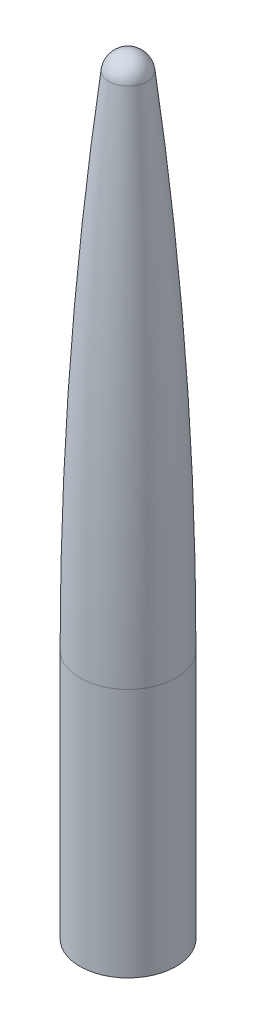
ISO-10303-21;
HEADER;
FILE_DESCRIPTION(('STEP AP214'),'2;1');
FILE_NAME('part.step','',(''),(''),'','','');
FILE_SCHEMA(('AUTOMOTIVE_DESIGN { 1 0 10303 214 1 1 1 1 }'));
ENDSEC;
DATA;
#1=APPLICATION_CONTEXT('core data for automotive mechanical design processes');
#2=APPLICATION_PROTOCOL_DEFINITION('international standard','automotive_design',2000,#1);
#3=PRODUCT_CONTEXT('',#1,'mechanical');
#4=PRODUCT('Part','Part','',(#3));
#5=PRODUCT_RELATED_PRODUCT_CATEGORY('part','',(#4));
#6=PRODUCT_DEFINITION_FORMATION('','',#4);
#7=PRODUCT_DEFINITION_CONTEXT('part definition',#1,'design');
#8=PRODUCT_DEFINITION('design','',#6,#7);
#9=PRODUCT_DEFINITION_SHAPE('','',#8);
#10=(LENGTH_UNIT() NAMED_UNIT(*) SI_UNIT(.MILLI.,.METRE.));
#11=(NAMED_UNIT(*) PLANE_ANGLE_UNIT() SI_UNIT($,.RADIAN.));
#12=(NAMED_UNIT(*) SI_UNIT($,.STERADIAN.) SOLID_ANGLE_UNIT());
#13=UNCERTAINTY_MEASURE_WITH_UNIT(LENGTH_MEASURE(1.E-05),#10,'distance_accuracy_value','');
#14=(GEOMETRIC_REPRESENTATION_CONTEXT(3) GLOBAL_UNCERTAINTY_ASSIGNED_CONTEXT((#13)) GLOBAL_UNIT_ASSIGNED_CONTEXT((#10,
#11,#12)) REPRESENTATION_CONTEXT('',''));
#15=CARTESIAN_POINT('',(0.,0.,0.));
#16=DIRECTION('',(0.,0.,1.));
#17=DIRECTION('',(1.,0.,0.));
#18=AXIS2_PLACEMENT_3D('',#15,#16,#17);
#19=CARTESIAN_POINT('',(0.,0.,0.));
#20=DIRECTION('',(0.,-1.,0.));
#21=DIRECTION('',(0.,0.,-1.));
#22=AXIS2_PLACEMENT_3D('',#19,#20,#21);
#23=PLANE('',#22);
#24=CARTESIAN_POINT('',(0.,0.,0.));
#25=DIRECTION('',(0.,-1.,0.));
#26=DIRECTION('',(0.,0.,-1.));
#27=AXIS2_PLACEMENT_3D('',#24,#25,#26);
#28=CIRCLE('',#27,2.5);
#29=CARTESIAN_POINT('',(0.,0.,-2.5));
#30=VERTEX_POINT('',#29);
#31=EDGE_CURVE('E10',#30,#30,#28,.T.);
#32=ORIENTED_EDGE('',*,*,#31,.T.);
#33=EDGE_LOOP('',(#32));
#34=FACE_BOUND('',#33,.T.);
#35=ADVANCED_FACE('F37',(#34),#23,.T.);
#36=CARTESIAN_POINT('',(0.,0.,0.));
#37=DIRECTION('',(0.,-1.,0.));
#38=DIRECTION('',(0.,0.,-1.));
#39=AXIS2_PLACEMENT_3D('',#36,#37,#38);
#40=CYLINDRICAL_SURFACE('',#39,2.5);
#41=CARTESIAN_POINT('',(0.,13.,0.));
#42=DIRECTION('',(0.,-1.,0.));
#43=DIRECTION('',(0.,0.,-1.));
#44=AXIS2_PLACEMENT_3D('',#41,#42,#43);
#45=CIRCLE('',#44,2.5);
#46=CARTESIAN_POINT('',(0.,13.,-2.5));
#47=VERTEX_POINT('',#46);
#48=EDGE_CURVE('E43',#47,#47,#45,.T.);
#49=ORIENTED_EDGE('',*,*,#48,.T.);
#50=EDGE_LOOP('',(#49));
#51=FACE_BOUND('',#50,.T.);
#52=ORIENTED_EDGE('',*,*,#31,.F.);
#53=EDGE_LOOP('',(#52));
#54=FACE_BOUND('',#53,.T.);
#55=ADVANCED_FACE('F63',(#51,#54),#40,.T.);
#56=CARTESIAN_POINT('',(0.,13.,0.));
#57=DIRECTION('',(0.,-1.,0.));
#58=DIRECTION('',(0.,0.,-1.));
#59=AXIS2_PLACEMENT_3D('',#56,#57,#58);
#60=DEGENERATE_TOROIDAL_SURFACE('',#59,224.583333333333,227.083333333333,.F.);
#61=CARTESIAN_POINT('',(0.,39.1150018429783,0.));
#62=DIRECTION('',(0.,-1.,0.));
#63=DIRECTION('',(0.,0.,-1.));
#64=AXIS2_PLACEMENT_3D('',#61,#62,#63);
#65=CIRCLE('',#64,0.993365278289748);
#66=CARTESIAN_POINT('',(0.,39.1150018429783,-0.993365278289748));
#67=VERTEX_POINT('',#66);
#68=EDGE_CURVE('E47',#67,#67,#65,.T.);
#69=ORIENTED_EDGE('',*,*,#68,.T.);
#70=EDGE_LOOP('',(#69));
#71=FACE_BOUND('',#70,.T.);
#72=ORIENTED_EDGE('',*,*,#48,.F.);
#73=EDGE_LOOP('',(#72));
#74=FACE_BOUND('',#73,.T.);
#75=ADVANCED_FACE('F54',(#71,#74),#60,.F.);
#76=CARTESIAN_POINT('',(0.,39.,0.));
#77=DIRECTION('',(0.,-1.,0.));
#78=DIRECTION('',(1.,0.,0.));
#79=AXIS2_PLACEMENT_3D('',#76,#77,#78);
#80=SPHERICAL_SURFACE('',#79,1.00000000000003);
#81=ORIENTED_EDGE('',*,*,#68,.F.);
#82=EDGE_LOOP('',(#81));
#83=FACE_BOUND('',#82,.T.);
#84=ADVANCED_FACE('F57',(#83),#80,.T.);
#85=CLOSED_SHELL('',(#35,#55,#75,#84));
#86=MANIFOLD_SOLID_BREP('B2',#85);
#87=ADVANCED_BREP_SHAPE_REPRESENTATION('',(#18,#86),#14);
#88=SHAPE_DEFINITION_REPRESENTATION(#9,#87);
ENDSEC;
END-ISO-10303-21;
